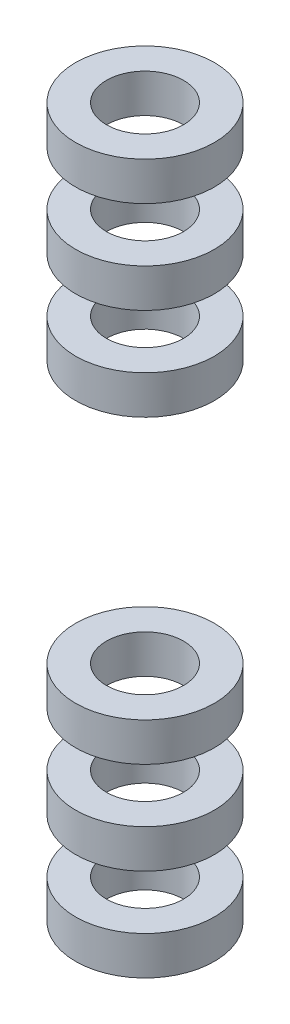
ISO-10303-21;
HEADER;
FILE_DESCRIPTION(('STEP AP214'),'2;1');
FILE_NAME('part.step','',(''),(''),'','','');
FILE_SCHEMA(('AUTOMOTIVE_DESIGN { 1 0 10303 214 1 1 1 1 }'));
ENDSEC;
DATA;
#1=APPLICATION_CONTEXT('core data for automotive mechanical design processes');
#2=APPLICATION_PROTOCOL_DEFINITION('international standard','automotive_design',2000,#1);
#3=PRODUCT_CONTEXT('',#1,'mechanical');
#4=PRODUCT('Part','Part','',(#3));
#5=PRODUCT_RELATED_PRODUCT_CATEGORY('part','',(#4));
#6=PRODUCT_DEFINITION_FORMATION('','',#4);
#7=PRODUCT_DEFINITION_CONTEXT('part definition',#1,'design');
#8=PRODUCT_DEFINITION('design','',#6,#7);
#9=PRODUCT_DEFINITION_SHAPE('','',#8);
#10=(LENGTH_UNIT() NAMED_UNIT(*) SI_UNIT(.MILLI.,.METRE.));
#11=(NAMED_UNIT(*) PLANE_ANGLE_UNIT() SI_UNIT($,.RADIAN.));
#12=(NAMED_UNIT(*) SI_UNIT($,.STERADIAN.) SOLID_ANGLE_UNIT());
#13=UNCERTAINTY_MEASURE_WITH_UNIT(LENGTH_MEASURE(1.E-05),#10,'distance_accuracy_value','');
#14=(GEOMETRIC_REPRESENTATION_CONTEXT(3) GLOBAL_UNCERTAINTY_ASSIGNED_CONTEXT((#13)) GLOBAL_UNIT_ASSIGNED_CONTEXT((#10,
#11,#12)) REPRESENTATION_CONTEXT('',''));
#15=CARTESIAN_POINT('',(0.,0.,0.));
#16=DIRECTION('',(0.,0.,1.));
#17=DIRECTION('',(1.,0.,0.));
#18=AXIS2_PLACEMENT_3D('',#15,#16,#17);
#19=CARTESIAN_POINT('',(0.,460.,0.));
#20=DIRECTION('',(0.,-1.,0.));
#21=DIRECTION('',(0.,0.,-1.));
#22=AXIS2_PLACEMENT_3D('',#19,#20,#21);
#23=CYLINDRICAL_SURFACE('',#22,45.);
#24=CARTESIAN_POINT('',(0.,400.,0.));
#25=DIRECTION('',(0.,1.,0.));
#26=DIRECTION('',(0.,0.,1.));
#27=AXIS2_PLACEMENT_3D('',#24,#25,#26);
#28=CIRCLE('',#27,45.);
#29=CARTESIAN_POINT('',(0.,400.,45.));
#30=VERTEX_POINT('',#29);
#31=EDGE_CURVE('E47',#30,#30,#28,.T.);
#32=ORIENTED_EDGE('',*,*,#31,.F.);
#33=EDGE_LOOP('',(#32));
#34=FACE_BOUND('',#33,.T.);
#35=CARTESIAN_POINT('',(0.,375.,0.));
#36=DIRECTION('',(0.,-1.,0.));
#37=DIRECTION('',(0.,0.,-1.));
#38=AXIS2_PLACEMENT_3D('',#35,#36,#37);
#39=CIRCLE('',#38,45.);
#40=CARTESIAN_POINT('',(0.,375.,-45.));
#41=VERTEX_POINT('',#40);
#42=EDGE_CURVE('E11',#41,#41,#39,.T.);
#43=ORIENTED_EDGE('',*,*,#42,.F.);
#44=EDGE_LOOP('',(#43));
#45=FACE_BOUND('',#44,.T.);
#46=ADVANCED_FACE('F41',(#34,#45),#23,.T.);
#47=CARTESIAN_POINT('',(0.,460.,0.));
#48=DIRECTION('',(0.,-1.,0.));
#49=DIRECTION('',(0.,0.,-1.));
#50=AXIS2_PLACEMENT_3D('',#47,#48,#49);
#51=CYLINDRICAL_SURFACE('',#50,25.);
#52=CARTESIAN_POINT('',(0.,400.,0.));
#53=DIRECTION('',(0.,1.,0.));
#54=DIRECTION('',(0.,0.,1.));
#55=AXIS2_PLACEMENT_3D('',#52,#53,#54);
#56=CIRCLE('',#55,25.);
#57=CARTESIAN_POINT('',(0.,400.,25.));
#58=VERTEX_POINT('',#57);
#59=EDGE_CURVE('E55',#58,#58,#56,.T.);
#60=ORIENTED_EDGE('',*,*,#59,.T.);
#61=EDGE_LOOP('',(#60));
#62=FACE_BOUND('',#61,.T.);
#63=CARTESIAN_POINT('',(0.,375.,0.));
#64=DIRECTION('',(0.,-1.,0.));
#65=DIRECTION('',(0.,0.,-1.));
#66=AXIS2_PLACEMENT_3D('',#63,#64,#65);
#67=CIRCLE('',#66,25.);
#68=CARTESIAN_POINT('',(0.,375.,-25.));
#69=VERTEX_POINT('',#68);
#70=EDGE_CURVE('E51',#69,#69,#67,.T.);
#71=ORIENTED_EDGE('',*,*,#70,.T.);
#72=EDGE_LOOP('',(#71));
#73=FACE_BOUND('',#72,.T.);
#74=ADVANCED_FACE('F61',(#62,#73),#51,.F.);
#75=CARTESIAN_POINT('',(-45.0000000000001,400.,154.));
#76=DIRECTION('',(0.,1.,0.));
#77=DIRECTION('',(0.,0.,1.));
#78=AXIS2_PLACEMENT_3D('',#75,#76,#77);
#79=PLANE('',#78);
#80=ORIENTED_EDGE('',*,*,#59,.F.);
#81=EDGE_LOOP('',(#80));
#82=FACE_BOUND('',#81,.T.);
#83=ORIENTED_EDGE('',*,*,#31,.T.);
#84=EDGE_LOOP('',(#83));
#85=FACE_BOUND('',#84,.T.);
#86=ADVANCED_FACE('F64',(#82,#85),#79,.T.);
#87=CARTESIAN_POINT('',(45.,375.,154.));
#88=DIRECTION('',(0.,-1.,0.));
#89=DIRECTION('',(0.,0.,-1.));
#90=AXIS2_PLACEMENT_3D('',#87,#88,#89);
#91=PLANE('',#90);
#92=ORIENTED_EDGE('',*,*,#70,.F.);
#93=EDGE_LOOP('',(#92));
#94=FACE_BOUND('',#93,.T.);
#95=ORIENTED_EDGE('',*,*,#42,.T.);
#96=EDGE_LOOP('',(#95));
#97=FACE_BOUND('',#96,.T.);
#98=ADVANCED_FACE('F66',(#94,#97),#91,.T.);
#99=CLOSED_SHELL('',(#46,#74,#86,#98));
#100=MANIFOLD_SOLID_BREP('B2',#99);
#101=CARTESIAN_POINT('',(0.,460.,0.));
#102=DIRECTION('',(0.,-1.,0.));
#103=DIRECTION('',(0.,0.,-1.));
#104=AXIS2_PLACEMENT_3D('',#101,#102,#103);
#105=CYLINDRICAL_SURFACE('',#104,25.);
#106=CARTESIAN_POINT('',(0.,120.,0.));
#107=DIRECTION('',(0.,-1.,0.));
#108=DIRECTION('',(0.,0.,-1.));
#109=AXIS2_PLACEMENT_3D('',#106,#107,#108);
#110=CIRCLE('',#109,25.);
#111=CARTESIAN_POINT('',(0.,120.,-25.));
#112=VERTEX_POINT('',#111);
#113=EDGE_CURVE('E123',#112,#112,#110,.T.);
#114=ORIENTED_EDGE('',*,*,#113,.T.);
#115=EDGE_LOOP('',(#114));
#116=FACE_BOUND('',#115,.T.);
#117=CARTESIAN_POINT('',(0.,145.,0.));
#118=DIRECTION('',(0.,1.,0.));
#119=DIRECTION('',(0.,0.,1.));
#120=AXIS2_PLACEMENT_3D('',#117,#118,#119);
#121=CIRCLE('',#120,25.);
#122=CARTESIAN_POINT('',(0.,145.,25.));
#123=VERTEX_POINT('',#122);
#124=EDGE_CURVE('E121',#123,#123,#121,.T.);
#125=ORIENTED_EDGE('',*,*,#124,.T.);
#126=EDGE_LOOP('',(#125));
#127=FACE_BOUND('',#126,.T.);
#128=ADVANCED_FACE('F110',(#116,#127),#105,.F.);
#129=CARTESIAN_POINT('',(45.,120.,154.));
#130=DIRECTION('',(0.,-1.,0.));
#131=DIRECTION('',(0.,0.,-1.));
#132=AXIS2_PLACEMENT_3D('',#129,#130,#131);
#133=PLANE('',#132);
#134=ORIENTED_EDGE('',*,*,#113,.F.);
#135=EDGE_LOOP('',(#134));
#136=FACE_BOUND('',#135,.T.);
#137=CARTESIAN_POINT('',(0.,120.,0.));
#138=DIRECTION('',(0.,-1.,0.));
#139=DIRECTION('',(0.,0.,-1.));
#140=AXIS2_PLACEMENT_3D('',#137,#138,#139);
#141=CIRCLE('',#140,45.);
#142=CARTESIAN_POINT('',(0.,120.,-45.));
#143=VERTEX_POINT('',#142);
#144=EDGE_CURVE('E114',#143,#143,#141,.T.);
#145=ORIENTED_EDGE('',*,*,#144,.T.);
#146=EDGE_LOOP('',(#145));
#147=FACE_BOUND('',#146,.T.);
#148=ADVANCED_FACE('F132',(#136,#147),#133,.T.);
#149=CARTESIAN_POINT('',(-45.,145.,154.));
#150=DIRECTION('',(0.,1.,0.));
#151=DIRECTION('',(0.,0.,1.));
#152=AXIS2_PLACEMENT_3D('',#149,#150,#151);
#153=PLANE('',#152);
#154=ORIENTED_EDGE('',*,*,#124,.F.);
#155=EDGE_LOOP('',(#154));
#156=FACE_BOUND('',#155,.T.);
#157=CARTESIAN_POINT('',(0.,145.,0.));
#158=DIRECTION('',(0.,1.,0.));
#159=DIRECTION('',(0.,0.,1.));
#160=AXIS2_PLACEMENT_3D('',#157,#158,#159);
#161=CIRCLE('',#160,45.);
#162=CARTESIAN_POINT('',(0.,145.,45.));
#163=VERTEX_POINT('',#162);
#164=EDGE_CURVE('E40',#163,#163,#161,.T.);
#165=ORIENTED_EDGE('',*,*,#164,.T.);
#166=EDGE_LOOP('',(#165));
#167=FACE_BOUND('',#166,.T.);
#168=ADVANCED_FACE('F130',(#156,#167),#153,.T.);
#169=CARTESIAN_POINT('',(0.,460.,0.));
#170=DIRECTION('',(0.,-1.,0.));
#171=DIRECTION('',(0.,0.,-1.));
#172=AXIS2_PLACEMENT_3D('',#169,#170,#171);
#173=CYLINDRICAL_SURFACE('',#172,45.);
#174=ORIENTED_EDGE('',*,*,#144,.F.);
#175=EDGE_LOOP('',(#174));
#176=FACE_BOUND('',#175,.T.);
#177=ORIENTED_EDGE('',*,*,#164,.F.);
#178=EDGE_LOOP('',(#177));
#179=FACE_BOUND('',#178,.T.);
#180=ADVANCED_FACE('F112',(#176,#179),#173,.T.);
#181=CLOSED_SHELL('',(#128,#148,#168,#180));
#182=MANIFOLD_SOLID_BREP('B6',#181);
#183=CARTESIAN_POINT('',(0.,460.,0.));
#184=DIRECTION('',(0.,-1.,0.));
#185=DIRECTION('',(0.,0.,-1.));
#186=AXIS2_PLACEMENT_3D('',#183,#184,#185);
#187=CYLINDRICAL_SURFACE('',#186,25.);
#188=CARTESIAN_POINT('',(0.,85.,0.));
#189=DIRECTION('',(0.,1.,0.));
#190=DIRECTION('',(0.,0.,1.));
#191=AXIS2_PLACEMENT_3D('',#188,#189,#190);
#192=CIRCLE('',#191,25.);
#193=CARTESIAN_POINT('',(0.,85.,25.));
#194=VERTEX_POINT('',#193);
#195=EDGE_CURVE('E192',#194,#194,#192,.T.);
#196=ORIENTED_EDGE('',*,*,#195,.T.);
#197=EDGE_LOOP('',(#196));
#198=FACE_BOUND('',#197,.T.);
#199=CARTESIAN_POINT('',(0.,60.,0.));
#200=DIRECTION('',(0.,-1.,0.));
#201=DIRECTION('',(1.,0.,0.));
#202=AXIS2_PLACEMENT_3D('',#199,#200,#201);
#203=CIRCLE('',#202,25.);
#204=CARTESIAN_POINT('',(25.,60.,0.));
#205=VERTEX_POINT('',#204);
#206=EDGE_CURVE('E190',#205,#205,#203,.T.);
#207=ORIENTED_EDGE('',*,*,#206,.T.);
#208=EDGE_LOOP('',(#207));
#209=FACE_BOUND('',#208,.T.);
#210=ADVANCED_FACE('F179',(#198,#209),#187,.F.);
#211=CARTESIAN_POINT('',(-45.,85.,154.));
#212=DIRECTION('',(0.,1.,0.));
#213=DIRECTION('',(0.,0.,1.));
#214=AXIS2_PLACEMENT_3D('',#211,#212,#213);
#215=PLANE('',#214);
#216=ORIENTED_EDGE('',*,*,#195,.F.);
#217=EDGE_LOOP('',(#216));
#218=FACE_BOUND('',#217,.T.);
#219=CARTESIAN_POINT('',(0.,85.,0.));
#220=DIRECTION('',(0.,1.,0.));
#221=DIRECTION('',(0.,0.,1.));
#222=AXIS2_PLACEMENT_3D('',#219,#220,#221);
#223=CIRCLE('',#222,45.);
#224=CARTESIAN_POINT('',(0.,85.,45.));
#225=VERTEX_POINT('',#224);
#226=EDGE_CURVE('E183',#225,#225,#223,.T.);
#227=ORIENTED_EDGE('',*,*,#226,.T.);
#228=EDGE_LOOP('',(#227));
#229=FACE_BOUND('',#228,.T.);
#230=ADVANCED_FACE('F201',(#218,#229),#215,.T.);
#231=CARTESIAN_POINT('',(45.,60.,154.));
#232=DIRECTION('',(0.,-1.,0.));
#233=DIRECTION('',(1.,0.,0.));
#234=AXIS2_PLACEMENT_3D('',#231,#232,#233);
#235=PLANE('',#234);
#236=ORIENTED_EDGE('',*,*,#206,.F.);
#237=EDGE_LOOP('',(#236));
#238=FACE_BOUND('',#237,.T.);
#239=CARTESIAN_POINT('',(0.,60.,0.));
#240=DIRECTION('',(0.,-1.,0.));
#241=DIRECTION('',(1.,0.,0.));
#242=AXIS2_PLACEMENT_3D('',#239,#240,#241);
#243=CIRCLE('',#242,45.);
#244=CARTESIAN_POINT('',(45.,60.,0.));
#245=VERTEX_POINT('',#244);
#246=EDGE_CURVE('E109',#245,#245,#243,.T.);
#247=ORIENTED_EDGE('',*,*,#246,.T.);
#248=EDGE_LOOP('',(#247));
#249=FACE_BOUND('',#248,.T.);
#250=ADVANCED_FACE('F199',(#238,#249),#235,.T.);
#251=CARTESIAN_POINT('',(0.,460.,0.));
#252=DIRECTION('',(0.,-1.,0.));
#253=DIRECTION('',(0.,0.,-1.));
#254=AXIS2_PLACEMENT_3D('',#251,#252,#253);
#255=CYLINDRICAL_SURFACE('',#254,45.);
#256=ORIENTED_EDGE('',*,*,#226,.F.);
#257=EDGE_LOOP('',(#256));
#258=FACE_BOUND('',#257,.T.);
#259=ORIENTED_EDGE('',*,*,#246,.F.);
#260=EDGE_LOOP('',(#259));
#261=FACE_BOUND('',#260,.T.);
#262=ADVANCED_FACE('F181',(#258,#261),#255,.T.);
#263=CLOSED_SHELL('',(#210,#230,#250,#262));
#264=MANIFOLD_SOLID_BREP('B35',#263);
#265=CARTESIAN_POINT('',(0.,460.,0.));
#266=DIRECTION('',(0.,-1.,0.));
#267=DIRECTION('',(0.,0.,-1.));
#268=AXIS2_PLACEMENT_3D('',#265,#266,#267);
#269=CYLINDRICAL_SURFACE('',#268,45.);
#270=CARTESIAN_POINT('',(0.,0.,0.));
#271=DIRECTION('',(0.,1.,0.));
#272=DIRECTION('',(0.,0.,1.));
#273=AXIS2_PLACEMENT_3D('',#270,#271,#272);
#274=CIRCLE('',#273,45.);
#275=CARTESIAN_POINT('',(0.,0.,45.));
#276=VERTEX_POINT('',#275);
#277=EDGE_CURVE('E264',#276,#276,#274,.T.);
#278=ORIENTED_EDGE('',*,*,#277,.T.);
#279=EDGE_LOOP('',(#278));
#280=FACE_BOUND('',#279,.T.);
#281=CARTESIAN_POINT('',(0.,25.,0.));
#282=DIRECTION('',(0.,1.,0.));
#283=DIRECTION('',(0.,0.,1.));
#284=AXIS2_PLACEMENT_3D('',#281,#282,#283);
#285=CIRCLE('',#284,45.);
#286=CARTESIAN_POINT('',(0.,25.,45.));
#287=VERTEX_POINT('',#286);
#288=EDGE_CURVE('E178',#287,#287,#285,.T.);
#289=ORIENTED_EDGE('',*,*,#288,.F.);
#290=EDGE_LOOP('',(#289));
#291=FACE_BOUND('',#290,.T.);
#292=ADVANCED_FACE('F248',(#280,#291),#269,.T.);
#293=CARTESIAN_POINT('',(0.,0.,0.));
#294=DIRECTION('',(0.,1.,0.));
#295=DIRECTION('',(0.,0.,1.));
#296=AXIS2_PLACEMENT_3D('',#293,#294,#295);
#297=PLANE('',#296);
#298=ORIENTED_EDGE('',*,*,#277,.F.);
#299=EDGE_LOOP('',(#298));
#300=FACE_BOUND('',#299,.T.);
#301=CARTESIAN_POINT('',(0.,0.,0.));
#302=DIRECTION('',(0.,1.,0.));
#303=DIRECTION('',(0.,0.,1.));
#304=AXIS2_PLACEMENT_3D('',#301,#302,#303);
#305=CIRCLE('',#304,25.);
#306=CARTESIAN_POINT('',(0.,0.,25.));
#307=VERTEX_POINT('',#306);
#308=EDGE_CURVE('E259',#307,#307,#305,.T.);
#309=ORIENTED_EDGE('',*,*,#308,.T.);
#310=EDGE_LOOP('',(#309));
#311=FACE_BOUND('',#310,.T.);
#312=ADVANCED_FACE('F271',(#300,#311),#297,.F.);
#313=CARTESIAN_POINT('',(0.,460.,0.));
#314=DIRECTION('',(0.,-1.,0.));
#315=DIRECTION('',(0.,0.,-1.));
#316=AXIS2_PLACEMENT_3D('',#313,#314,#315);
#317=CYLINDRICAL_SURFACE('',#316,25.);
#318=ORIENTED_EDGE('',*,*,#308,.F.);
#319=EDGE_LOOP('',(#318));
#320=FACE_BOUND('',#319,.T.);
#321=CARTESIAN_POINT('',(0.,25.,0.));
#322=DIRECTION('',(0.,1.,0.));
#323=DIRECTION('',(0.,0.,1.));
#324=AXIS2_PLACEMENT_3D('',#321,#322,#323);
#325=CIRCLE('',#324,25.);
#326=CARTESIAN_POINT('',(0.,25.,25.));
#327=VERTEX_POINT('',#326);
#328=EDGE_CURVE('E255',#327,#327,#325,.T.);
#329=ORIENTED_EDGE('',*,*,#328,.T.);
#330=EDGE_LOOP('',(#329));
#331=FACE_BOUND('',#330,.T.);
#332=ADVANCED_FACE('F250',(#320,#331),#317,.F.);
#333=CARTESIAN_POINT('',(-45.,25.,154.));
#334=DIRECTION('',(0.,1.,0.));
#335=DIRECTION('',(0.,0.,1.));
#336=AXIS2_PLACEMENT_3D('',#333,#334,#335);
#337=PLANE('',#336);
#338=ORIENTED_EDGE('',*,*,#328,.F.);
#339=EDGE_LOOP('',(#338));
#340=FACE_BOUND('',#339,.T.);
#341=ORIENTED_EDGE('',*,*,#288,.T.);
#342=EDGE_LOOP('',(#341));
#343=FACE_BOUND('',#342,.T.);
#344=ADVANCED_FACE('F278',(#340,#343),#337,.T.);
#345=CLOSED_SHELL('',(#292,#312,#332,#344));
#346=MANIFOLD_SOLID_BREP('B104',#345);
#347=CARTESIAN_POINT('',(0.,460.,0.));
#348=DIRECTION('',(0.,-1.,0.));
#349=DIRECTION('',(0.,0.,-1.));
#350=AXIS2_PLACEMENT_3D('',#347,#348,#349);
#351=CYLINDRICAL_SURFACE('',#350,45.);
#352=CARTESIAN_POINT('',(0.,460.,0.));
#353=DIRECTION('',(0.,1.,0.));
#354=DIRECTION('',(0.,0.,1.));
#355=AXIS2_PLACEMENT_3D('',#352,#353,#354);
#356=CIRCLE('',#355,45.);
#357=CARTESIAN_POINT('',(0.,460.,45.));
#358=VERTEX_POINT('',#357);
#359=EDGE_CURVE('E323',#358,#358,#356,.T.);
#360=ORIENTED_EDGE('',*,*,#359,.F.);
#361=EDGE_LOOP('',(#360));
#362=FACE_BOUND('',#361,.T.);
#363=CARTESIAN_POINT('',(0.,435.,0.));
#364=DIRECTION('',(0.,-1.,0.));
#365=DIRECTION('',(0.,0.,-1.));
#366=AXIS2_PLACEMENT_3D('',#363,#364,#365);
#367=CIRCLE('',#366,45.);
#368=CARTESIAN_POINT('',(0.,435.,-45.));
#369=VERTEX_POINT('',#368);
#370=EDGE_CURVE('E247',#369,#369,#367,.T.);
#371=ORIENTED_EDGE('',*,*,#370,.F.);
#372=EDGE_LOOP('',(#371));
#373=FACE_BOUND('',#372,.T.);
#374=ADVANCED_FACE('F316',(#362,#373),#351,.T.);
#375=CARTESIAN_POINT('',(0.,460.,0.));
#376=DIRECTION('',(0.,-1.,0.));
#377=DIRECTION('',(0.,0.,-1.));
#378=AXIS2_PLACEMENT_3D('',#375,#376,#377);
#379=CYLINDRICAL_SURFACE('',#378,25.);
#380=CARTESIAN_POINT('',(0.,460.,0.));
#381=DIRECTION('',(0.,1.,0.));
#382=DIRECTION('',(0.,0.,1.));
#383=AXIS2_PLACEMENT_3D('',#380,#381,#382);
#384=CIRCLE('',#383,25.);
#385=CARTESIAN_POINT('',(0.,460.,25.));
#386=VERTEX_POINT('',#385);
#387=EDGE_CURVE('E332',#386,#386,#384,.T.);
#388=ORIENTED_EDGE('',*,*,#387,.T.);
#389=EDGE_LOOP('',(#388));
#390=FACE_BOUND('',#389,.T.);
#391=CARTESIAN_POINT('',(0.,435.,0.));
#392=DIRECTION('',(0.,-1.,0.));
#393=DIRECTION('',(0.,0.,-1.));
#394=AXIS2_PLACEMENT_3D('',#391,#392,#393);
#395=CIRCLE('',#394,25.);
#396=CARTESIAN_POINT('',(0.,435.,-25.));
#397=VERTEX_POINT('',#396);
#398=EDGE_CURVE('E327',#397,#397,#395,.T.);
#399=ORIENTED_EDGE('',*,*,#398,.T.);
#400=EDGE_LOOP('',(#399));
#401=FACE_BOUND('',#400,.T.);
#402=ADVANCED_FACE('F318',(#390,#401),#379,.F.);
#403=CARTESIAN_POINT('',(0.,460.,0.));
#404=DIRECTION('',(0.,1.,0.));
#405=DIRECTION('',(0.,0.,1.));
#406=AXIS2_PLACEMENT_3D('',#403,#404,#405);
#407=PLANE('',#406);
#408=ORIENTED_EDGE('',*,*,#359,.T.);
#409=EDGE_LOOP('',(#408));
#410=FACE_BOUND('',#409,.T.);
#411=ORIENTED_EDGE('',*,*,#387,.F.);
#412=EDGE_LOOP('',(#411));
#413=FACE_BOUND('',#412,.T.);
#414=ADVANCED_FACE('F339',(#410,#413),#407,.T.);
#415=CARTESIAN_POINT('',(45.,435.,154.));
#416=DIRECTION('',(0.,-1.,0.));
#417=DIRECTION('',(0.,0.,-1.));
#418=AXIS2_PLACEMENT_3D('',#415,#416,#417);
#419=PLANE('',#418);
#420=ORIENTED_EDGE('',*,*,#398,.F.);
#421=EDGE_LOOP('',(#420));
#422=FACE_BOUND('',#421,.T.);
#423=ORIENTED_EDGE('',*,*,#370,.T.);
#424=EDGE_LOOP('',(#423));
#425=FACE_BOUND('',#424,.T.);
#426=ADVANCED_FACE('F341',(#422,#425),#419,.T.);
#427=CLOSED_SHELL('',(#374,#402,#414,#426));
#428=MANIFOLD_SOLID_BREP('B173',#427);
#429=CARTESIAN_POINT('',(0.,460.,0.));
#430=DIRECTION('',(0.,-1.,0.));
#431=DIRECTION('',(0.,0.,-1.));
#432=AXIS2_PLACEMENT_3D('',#429,#430,#431);
#433=CYLINDRICAL_SURFACE('',#432,25.);
#434=CARTESIAN_POINT('',(0.,315.,0.));
#435=DIRECTION('',(0.,-1.,0.));
#436=DIRECTION('',(0.,0.,-1.));
#437=AXIS2_PLACEMENT_3D('',#434,#435,#436);
#438=CIRCLE('',#437,25.);
#439=CARTESIAN_POINT('',(0.,315.,-25.));
#440=VERTEX_POINT('',#439);
#441=EDGE_CURVE('E391',#440,#440,#438,.T.);
#442=ORIENTED_EDGE('',*,*,#441,.T.);
#443=EDGE_LOOP('',(#442));
#444=FACE_BOUND('',#443,.T.);
#445=CARTESIAN_POINT('',(0.,340.,0.));
#446=DIRECTION('',(0.,1.,0.));
#447=DIRECTION('',(0.,0.,1.));
#448=AXIS2_PLACEMENT_3D('',#445,#446,#447);
#449=CIRCLE('',#448,25.);
#450=CARTESIAN_POINT('',(0.,340.,25.));
#451=VERTEX_POINT('',#450);
#452=EDGE_CURVE('E381',#451,#451,#449,.T.);
#453=ORIENTED_EDGE('',*,*,#452,.T.);
#454=EDGE_LOOP('',(#453));
#455=FACE_BOUND('',#454,.T.);
#456=ADVANCED_FACE('F377',(#444,#455),#433,.F.);
#457=CARTESIAN_POINT('',(45.,315.,154.));
#458=DIRECTION('',(0.,-1.,0.));
#459=DIRECTION('',(0.,0.,-1.));
#460=AXIS2_PLACEMENT_3D('',#457,#458,#459);
#461=PLANE('',#460);
#462=ORIENTED_EDGE('',*,*,#441,.F.);
#463=EDGE_LOOP('',(#462));
#464=FACE_BOUND('',#463,.T.);
#465=CARTESIAN_POINT('',(0.,315.,0.));
#466=DIRECTION('',(0.,-1.,0.));
#467=DIRECTION('',(0.,0.,-1.));
#468=AXIS2_PLACEMENT_3D('',#465,#466,#467);
#469=CIRCLE('',#468,45.);
#470=CARTESIAN_POINT('',(0.,315.,-45.));
#471=VERTEX_POINT('',#470);
#472=EDGE_CURVE('E389',#471,#471,#469,.T.);
#473=ORIENTED_EDGE('',*,*,#472,.T.);
#474=EDGE_LOOP('',(#473));
#475=FACE_BOUND('',#474,.T.);
#476=ADVANCED_FACE('F398',(#464,#475),#461,.T.);
#477=CARTESIAN_POINT('',(-45.,340.,154.));
#478=DIRECTION('',(0.,1.,0.));
#479=DIRECTION('',(0.,0.,1.));
#480=AXIS2_PLACEMENT_3D('',#477,#478,#479);
#481=PLANE('',#480);
#482=ORIENTED_EDGE('',*,*,#452,.F.);
#483=EDGE_LOOP('',(#482));
#484=FACE_BOUND('',#483,.T.);
#485=CARTESIAN_POINT('',(0.,340.,0.));
#486=DIRECTION('',(0.,1.,0.));
#487=DIRECTION('',(0.,0.,1.));
#488=AXIS2_PLACEMENT_3D('',#485,#486,#487);
#489=CIRCLE('',#488,45.);
#490=CARTESIAN_POINT('',(0.,340.,45.));
#491=VERTEX_POINT('',#490);
#492=EDGE_CURVE('E315',#491,#491,#489,.T.);
#493=ORIENTED_EDGE('',*,*,#492,.T.);
#494=EDGE_LOOP('',(#493));
#495=FACE_BOUND('',#494,.T.);
#496=ADVANCED_FACE('F402',(#484,#495),#481,.T.);
#497=CARTESIAN_POINT('',(0.,460.,0.));
#498=DIRECTION('',(0.,-1.,0.));
#499=DIRECTION('',(0.,0.,-1.));
#500=AXIS2_PLACEMENT_3D('',#497,#498,#499);
#501=CYLINDRICAL_SURFACE('',#500,45.);
#502=ORIENTED_EDGE('',*,*,#472,.F.);
#503=EDGE_LOOP('',(#502));
#504=FACE_BOUND('',#503,.T.);
#505=ORIENTED_EDGE('',*,*,#492,.F.);
#506=EDGE_LOOP('',(#505));
#507=FACE_BOUND('',#506,.T.);
#508=ADVANCED_FACE('F379',(#504,#507),#501,.T.);
#509=CLOSED_SHELL('',(#456,#476,#496,#508));
#510=MANIFOLD_SOLID_BREP('B242',#509);
#511=ADVANCED_BREP_SHAPE_REPRESENTATION('',(#18,#100,#182,#264,#346,#428,#510),#14);
#512=SHAPE_DEFINITION_REPRESENTATION(#9,#511);
ENDSEC;
END-ISO-10303-21;
